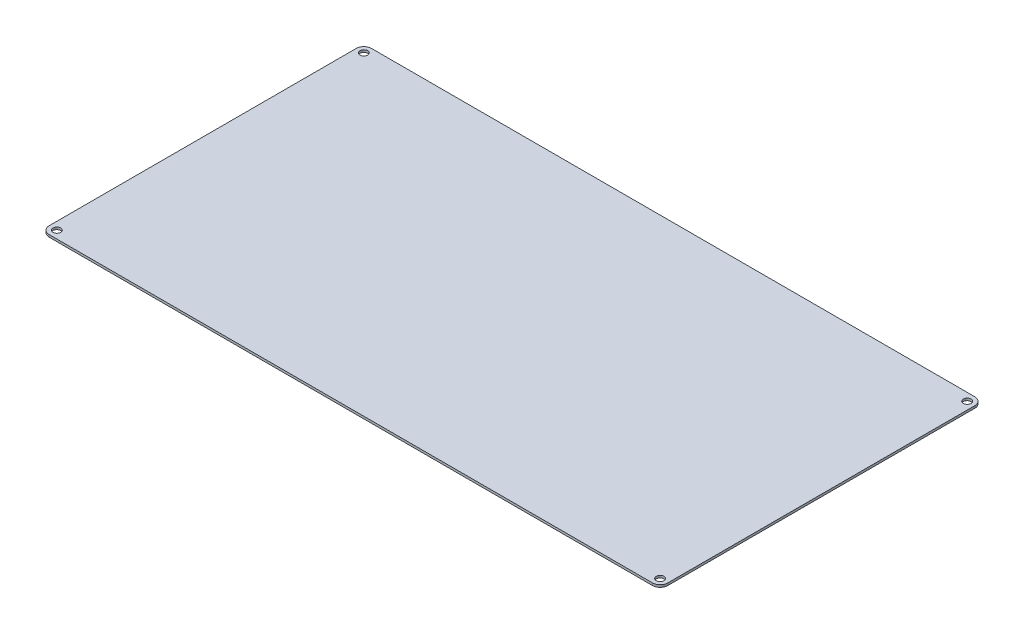
ISO-10303-21;
HEADER;
FILE_DESCRIPTION(('STEP AP214'),'2;1');
FILE_NAME('part.step','',(''),(''),'','','');
FILE_SCHEMA(('AUTOMOTIVE_DESIGN { 1 0 10303 214 1 1 1 1 }'));
ENDSEC;
DATA;
#1=APPLICATION_CONTEXT('core data for automotive mechanical design processes');
#2=APPLICATION_PROTOCOL_DEFINITION('international standard','automotive_design',2000,#1);
#3=PRODUCT_CONTEXT('',#1,'mechanical');
#4=PRODUCT('Part','Part','',(#3));
#5=PRODUCT_RELATED_PRODUCT_CATEGORY('part','',(#4));
#6=PRODUCT_DEFINITION_FORMATION('','',#4);
#7=PRODUCT_DEFINITION_CONTEXT('part definition',#1,'design');
#8=PRODUCT_DEFINITION('design','',#6,#7);
#9=PRODUCT_DEFINITION_SHAPE('','',#8);
#10=(LENGTH_UNIT() NAMED_UNIT(*) SI_UNIT(.MILLI.,.METRE.));
#11=(NAMED_UNIT(*) PLANE_ANGLE_UNIT() SI_UNIT($,.RADIAN.));
#12=(NAMED_UNIT(*) SI_UNIT($,.STERADIAN.) SOLID_ANGLE_UNIT());
#13=UNCERTAINTY_MEASURE_WITH_UNIT(LENGTH_MEASURE(1.E-05),#10,'distance_accuracy_value','');
#14=(GEOMETRIC_REPRESENTATION_CONTEXT(3) GLOBAL_UNCERTAINTY_ASSIGNED_CONTEXT((#13)) GLOBAL_UNIT_ASSIGNED_CONTEXT((#10,
#11,#12)) REPRESENTATION_CONTEXT('',''));
#15=CARTESIAN_POINT('',(0.,0.,0.));
#16=DIRECTION('',(0.,0.,1.));
#17=DIRECTION('',(1.,0.,0.));
#18=AXIS2_PLACEMENT_3D('',#15,#16,#17);
#19=CARTESIAN_POINT('',(398.,-1.5,-5.));
#20=DIRECTION('',(0.,1.,0.));
#21=DIRECTION('',(0.,0.,1.));
#22=AXIS2_PLACEMENT_3D('',#19,#20,#21);
#23=CYLINDRICAL_SURFACE('',#22,5.);
#24=CARTESIAN_POINT('',(398.,0.,-5.));
#25=DIRECTION('',(0.,1.,0.));
#26=DIRECTION('',(0.,0.,-1.));
#27=AXIS2_PLACEMENT_3D('',#24,#25,#26);
#28=CIRCLE('',#27,5.);
#29=CARTESIAN_POINT('',(398.,0.,0.));
#30=VERTEX_POINT('',#29);
#31=CARTESIAN_POINT('',(403.,0.,-5.));
#32=VERTEX_POINT('',#31);
#33=EDGE_CURVE('E135',#30,#32,#28,.T.);
#34=ORIENTED_EDGE('',*,*,#33,.F.);
#35=DIRECTION('',(0.,1.,0.));
#36=VECTOR('',#35,1.);
#37=CARTESIAN_POINT('',(398.,-1.5,0.));
#38=LINE('',#37,#36);
#39=CARTESIAN_POINT('',(398.,-1.5,0.));
#40=VERTEX_POINT('',#39);
#41=EDGE_CURVE('E11',#40,#30,#38,.T.);
#42=ORIENTED_EDGE('',*,*,#41,.F.);
#43=CARTESIAN_POINT('',(398.,-1.5,-5.));
#44=DIRECTION('',(0.,1.,0.));
#45=DIRECTION('',(0.,0.,-1.));
#46=AXIS2_PLACEMENT_3D('',#43,#44,#45);
#47=CIRCLE('',#46,5.);
#48=CARTESIAN_POINT('',(403.,-1.5,-5.));
#49=VERTEX_POINT('',#48);
#50=EDGE_CURVE('E156',#40,#49,#47,.T.);
#51=ORIENTED_EDGE('',*,*,#50,.T.);
#52=DIRECTION('',(0.,1.,0.));
#53=VECTOR('',#52,1.);
#54=CARTESIAN_POINT('',(403.,-1.5,-5.));
#55=LINE('',#54,#53);
#56=EDGE_CURVE('E41',#49,#32,#55,.T.);
#57=ORIENTED_EDGE('',*,*,#56,.T.);
#58=EDGE_LOOP('',(#34,#42,#51,#57));
#59=FACE_BOUND('',#58,.T.);
#60=ADVANCED_FACE('F38',(#59),#23,.T.);
#61=CARTESIAN_POINT('',(5.00000000000004,-1.5,0.));
#62=DIRECTION('',(0.,0.,1.));
#63=DIRECTION('',(1.,0.,0.));
#64=AXIS2_PLACEMENT_3D('',#61,#62,#63);
#65=PLANE('',#64);
#66=DIRECTION('',(1.,0.,0.));
#67=VECTOR('',#66,1.);
#68=CARTESIAN_POINT('',(5.00000000000004,0.,0.));
#69=LINE('',#68,#67);
#70=CARTESIAN_POINT('',(5.00000000000004,0.,0.));
#71=VERTEX_POINT('',#70);
#72=EDGE_CURVE('E154',#71,#30,#69,.T.);
#73=ORIENTED_EDGE('',*,*,#72,.F.);
#74=DIRECTION('',(0.,1.,0.));
#75=VECTOR('',#74,1.);
#76=CARTESIAN_POINT('',(5.00000000000004,-1.5,0.));
#77=LINE('',#76,#75);
#78=CARTESIAN_POINT('',(5.00000000000004,-1.5,0.));
#79=VERTEX_POINT('',#78);
#80=EDGE_CURVE('E47',#79,#71,#77,.T.);
#81=ORIENTED_EDGE('',*,*,#80,.F.);
#82=DIRECTION('',(1.,0.,0.));
#83=VECTOR('',#82,1.);
#84=CARTESIAN_POINT('',(5.00000000000004,-1.5,0.));
#85=LINE('',#84,#83);
#86=EDGE_CURVE('E125',#79,#40,#85,.T.);
#87=ORIENTED_EDGE('',*,*,#86,.T.);
#88=ORIENTED_EDGE('',*,*,#41,.T.);
#89=EDGE_LOOP('',(#73,#81,#87,#88));
#90=FACE_BOUND('',#89,.T.);
#91=ADVANCED_FACE('F168',(#90),#65,.T.);
#92=CARTESIAN_POINT('',(5.,-1.5,-5.));
#93=DIRECTION('',(0.,1.,0.));
#94=DIRECTION('',(0.,0.,1.));
#95=AXIS2_PLACEMENT_3D('',#92,#93,#94);
#96=CYLINDRICAL_SURFACE('',#95,5.);
#97=CARTESIAN_POINT('',(5.,0.,-5.));
#98=DIRECTION('',(0.,1.,0.));
#99=DIRECTION('',(0.,0.,-1.));
#100=AXIS2_PLACEMENT_3D('',#97,#98,#99);
#101=CIRCLE('',#100,5.);
#102=CARTESIAN_POINT('',(0.,0.,-5.00000000000004));
#103=VERTEX_POINT('',#102);
#104=EDGE_CURVE('E112',#103,#71,#101,.T.);
#105=ORIENTED_EDGE('',*,*,#104,.F.);
#106=DIRECTION('',(0.,1.,0.));
#107=VECTOR('',#106,1.);
#108=CARTESIAN_POINT('',(0.,-1.5,-5.00000000000004));
#109=LINE('',#108,#107);
#110=CARTESIAN_POINT('',(0.,-1.5,-5.00000000000004));
#111=VERTEX_POINT('',#110);
#112=EDGE_CURVE('E107',#111,#103,#109,.T.);
#113=ORIENTED_EDGE('',*,*,#112,.F.);
#114=CARTESIAN_POINT('',(5.,-1.5,-5.));
#115=DIRECTION('',(0.,1.,0.));
#116=DIRECTION('',(0.,0.,-1.));
#117=AXIS2_PLACEMENT_3D('',#114,#115,#116);
#118=CIRCLE('',#117,5.);
#119=EDGE_CURVE('E110',#111,#79,#118,.T.);
#120=ORIENTED_EDGE('',*,*,#119,.T.);
#121=ORIENTED_EDGE('',*,*,#80,.T.);
#122=EDGE_LOOP('',(#105,#113,#120,#121));
#123=FACE_BOUND('',#122,.T.);
#124=ADVANCED_FACE('F109',(#123),#96,.T.);
#125=CARTESIAN_POINT('',(0.,-1.5,-5.00000000000004));
#126=DIRECTION('',(-1.,0.,0.));
#127=DIRECTION('',(0.,0.,1.));
#128=AXIS2_PLACEMENT_3D('',#125,#126,#127);
#129=PLANE('',#128);
#130=DIRECTION('',(0.,0.,1.));
#131=VECTOR('',#130,1.);
#132=CARTESIAN_POINT('',(0.,0.,-5.00000000000004));
#133=LINE('',#132,#131);
#134=CARTESIAN_POINT('',(0.,0.,-205.));
#135=VERTEX_POINT('',#134);
#136=EDGE_CURVE('E151',#135,#103,#133,.T.);
#137=ORIENTED_EDGE('',*,*,#136,.F.);
#138=DIRECTION('',(0.,1.,0.));
#139=VECTOR('',#138,1.);
#140=CARTESIAN_POINT('',(0.,-1.5,-205.));
#141=LINE('',#140,#139);
#142=CARTESIAN_POINT('',(0.,-1.5,-205.));
#143=VERTEX_POINT('',#142);
#144=EDGE_CURVE('E117',#143,#135,#141,.T.);
#145=ORIENTED_EDGE('',*,*,#144,.F.);
#146=DIRECTION('',(0.,0.,1.));
#147=VECTOR('',#146,1.);
#148=CARTESIAN_POINT('',(0.,-1.5,-5.00000000000004));
#149=LINE('',#148,#147);
#150=EDGE_CURVE('E123',#143,#111,#149,.T.);
#151=ORIENTED_EDGE('',*,*,#150,.T.);
#152=ORIENTED_EDGE('',*,*,#112,.T.);
#153=EDGE_LOOP('',(#137,#145,#151,#152));
#154=FACE_BOUND('',#153,.T.);
#155=ADVANCED_FACE('F127',(#154),#129,.T.);
#156=CARTESIAN_POINT('',(5.,-1.5,-205.));
#157=DIRECTION('',(0.,1.,0.));
#158=DIRECTION('',(0.,0.,1.));
#159=AXIS2_PLACEMENT_3D('',#156,#157,#158);
#160=CYLINDRICAL_SURFACE('',#159,5.00000000000002);
#161=CARTESIAN_POINT('',(5.,0.,-205.));
#162=DIRECTION('',(0.,1.,0.));
#163=DIRECTION('',(0.,0.,1.));
#164=AXIS2_PLACEMENT_3D('',#161,#162,#163);
#165=CIRCLE('',#164,5.00000000000002);
#166=CARTESIAN_POINT('',(5.,0.,-210.));
#167=VERTEX_POINT('',#166);
#168=EDGE_CURVE('E148',#167,#135,#165,.T.);
#169=ORIENTED_EDGE('',*,*,#168,.F.);
#170=DIRECTION('',(0.,1.,0.));
#171=VECTOR('',#170,1.);
#172=CARTESIAN_POINT('',(5.,-1.5,-210.));
#173=LINE('',#172,#171);
#174=CARTESIAN_POINT('',(5.,-1.5,-210.));
#175=VERTEX_POINT('',#174);
#176=EDGE_CURVE('E160',#175,#167,#173,.T.);
#177=ORIENTED_EDGE('',*,*,#176,.F.);
#178=CARTESIAN_POINT('',(5.,-1.5,-205.));
#179=DIRECTION('',(0.,1.,0.));
#180=DIRECTION('',(0.,0.,1.));
#181=AXIS2_PLACEMENT_3D('',#178,#179,#180);
#182=CIRCLE('',#181,5.00000000000002);
#183=EDGE_CURVE('E128',#175,#143,#182,.T.);
#184=ORIENTED_EDGE('',*,*,#183,.T.);
#185=ORIENTED_EDGE('',*,*,#144,.T.);
#186=EDGE_LOOP('',(#169,#177,#184,#185));
#187=FACE_BOUND('',#186,.T.);
#188=ADVANCED_FACE('F181',(#187),#160,.T.);
#189=CARTESIAN_POINT('',(5.,-1.5,-210.));
#190=DIRECTION('',(0.,0.,-1.));
#191=DIRECTION('',(-1.,0.,0.));
#192=AXIS2_PLACEMENT_3D('',#189,#190,#191);
#193=PLANE('',#192);
#194=DIRECTION('',(-1.,0.,0.));
#195=VECTOR('',#194,1.);
#196=CARTESIAN_POINT('',(5.,0.,-210.));
#197=LINE('',#196,#195);
#198=CARTESIAN_POINT('',(398.,0.,-210.));
#199=VERTEX_POINT('',#198);
#200=EDGE_CURVE('E145',#199,#167,#197,.T.);
#201=ORIENTED_EDGE('',*,*,#200,.F.);
#202=DIRECTION('',(0.,1.,0.));
#203=VECTOR('',#202,1.);
#204=CARTESIAN_POINT('',(398.,-1.5,-210.));
#205=LINE('',#204,#203);
#206=CARTESIAN_POINT('',(398.,-1.5,-210.));
#207=VERTEX_POINT('',#206);
#208=EDGE_CURVE('E162',#207,#199,#205,.T.);
#209=ORIENTED_EDGE('',*,*,#208,.F.);
#210=DIRECTION('',(-1.,0.,0.));
#211=VECTOR('',#210,1.);
#212=CARTESIAN_POINT('',(5.,-1.5,-210.));
#213=LINE('',#212,#211);
#214=EDGE_CURVE('E130',#207,#175,#213,.T.);
#215=ORIENTED_EDGE('',*,*,#214,.T.);
#216=ORIENTED_EDGE('',*,*,#176,.T.);
#217=EDGE_LOOP('',(#201,#209,#215,#216));
#218=FACE_BOUND('',#217,.T.);
#219=ADVANCED_FACE('F184',(#218),#193,.T.);
#220=CARTESIAN_POINT('',(398.,-1.5,-205.));
#221=DIRECTION('',(0.,1.,0.));
#222=DIRECTION('',(0.,0.,1.));
#223=AXIS2_PLACEMENT_3D('',#220,#221,#222);
#224=CYLINDRICAL_SURFACE('',#223,5.00000000000002);
#225=CARTESIAN_POINT('',(398.,0.,-205.));
#226=DIRECTION('',(0.,1.,0.));
#227=DIRECTION('',(0.,0.,1.));
#228=AXIS2_PLACEMENT_3D('',#225,#226,#227);
#229=CIRCLE('',#228,5.00000000000002);
#230=CARTESIAN_POINT('',(403.,0.,-205.));
#231=VERTEX_POINT('',#230);
#232=EDGE_CURVE('E142',#231,#199,#229,.T.);
#233=ORIENTED_EDGE('',*,*,#232,.F.);
#234=DIRECTION('',(0.,1.,0.));
#235=VECTOR('',#234,1.);
#236=CARTESIAN_POINT('',(403.,-1.5,-205.));
#237=LINE('',#236,#235);
#238=CARTESIAN_POINT('',(403.,-1.5,-205.));
#239=VERTEX_POINT('',#238);
#240=EDGE_CURVE('E163',#239,#231,#237,.T.);
#241=ORIENTED_EDGE('',*,*,#240,.F.);
#242=CARTESIAN_POINT('',(398.,-1.5,-205.));
#243=DIRECTION('',(0.,1.,0.));
#244=DIRECTION('',(0.,0.,1.));
#245=AXIS2_PLACEMENT_3D('',#242,#243,#244);
#246=CIRCLE('',#245,5.00000000000002);
#247=EDGE_CURVE('E250',#239,#207,#246,.T.);
#248=ORIENTED_EDGE('',*,*,#247,.T.);
#249=ORIENTED_EDGE('',*,*,#208,.T.);
#250=EDGE_LOOP('',(#233,#241,#248,#249));
#251=FACE_BOUND('',#250,.T.);
#252=ADVANCED_FACE('F188',(#251),#224,.T.);
#253=CARTESIAN_POINT('',(403.,-1.5,-5.));
#254=DIRECTION('',(1.,0.,0.));
#255=DIRECTION('',(0.,0.,-1.));
#256=AXIS2_PLACEMENT_3D('',#253,#254,#255);
#257=PLANE('',#256);
#258=DIRECTION('',(0.,0.,-1.));
#259=VECTOR('',#258,1.);
#260=CARTESIAN_POINT('',(403.,0.,-5.));
#261=LINE('',#260,#259);
#262=EDGE_CURVE('E138',#32,#231,#261,.T.);
#263=ORIENTED_EDGE('',*,*,#262,.F.);
#264=ORIENTED_EDGE('',*,*,#56,.F.);
#265=DIRECTION('',(0.,0.,-1.));
#266=VECTOR('',#265,1.);
#267=CARTESIAN_POINT('',(403.,-1.5,-5.));
#268=LINE('',#267,#266);
#269=EDGE_CURVE('E248',#49,#239,#268,.T.);
#270=ORIENTED_EDGE('',*,*,#269,.T.);
#271=ORIENTED_EDGE('',*,*,#240,.T.);
#272=EDGE_LOOP('',(#263,#264,#270,#271));
#273=FACE_BOUND('',#272,.T.);
#274=ADVANCED_FACE('F165',(#273),#257,.T.);
#275=CARTESIAN_POINT('',(398.,-1.5,-5.));
#276=DIRECTION('',(0.,-1.,0.));
#277=DIRECTION('',(0.,0.,-1.));
#278=AXIS2_PLACEMENT_3D('',#275,#276,#277);
#279=PLANE('',#278);
#280=CARTESIAN_POINT('',(398.,-1.5,-205.));
#281=DIRECTION('',(0.,1.,0.));
#282=DIRECTION('',(0.,0.,1.));
#283=AXIS2_PLACEMENT_3D('',#280,#281,#282);
#284=CIRCLE('',#283,2.50000000000002);
#285=CARTESIAN_POINT('',(398.,-1.5,-202.5));
#286=VERTEX_POINT('',#285);
#287=EDGE_CURVE('E223',#286,#286,#284,.T.);
#288=ORIENTED_EDGE('',*,*,#287,.T.);
#289=EDGE_LOOP('',(#288));
#290=FACE_BOUND('',#289,.T.);
#291=CARTESIAN_POINT('',(398.,-1.5,-5.));
#292=DIRECTION('',(0.,1.,0.));
#293=DIRECTION('',(0.,0.,1.));
#294=AXIS2_PLACEMENT_3D('',#291,#292,#293);
#295=CIRCLE('',#294,2.50000000000002);
#296=CARTESIAN_POINT('',(398.,-1.5,-2.49999999999998));
#297=VERTEX_POINT('',#296);
#298=EDGE_CURVE('E231',#297,#297,#295,.T.);
#299=ORIENTED_EDGE('',*,*,#298,.T.);
#300=EDGE_LOOP('',(#299));
#301=FACE_BOUND('',#300,.T.);
#302=CARTESIAN_POINT('',(5.,-1.5,-5.));
#303=DIRECTION('',(0.,1.,0.));
#304=DIRECTION('',(0.,0.,1.));
#305=AXIS2_PLACEMENT_3D('',#302,#303,#304);
#306=CIRCLE('',#305,2.5);
#307=CARTESIAN_POINT('',(5.,-1.5,-2.5));
#308=VERTEX_POINT('',#307);
#309=EDGE_CURVE('E237',#308,#308,#306,.T.);
#310=ORIENTED_EDGE('',*,*,#309,.T.);
#311=EDGE_LOOP('',(#310));
#312=FACE_BOUND('',#311,.T.);
#313=CARTESIAN_POINT('',(5.,-1.5,-205.));
#314=DIRECTION('',(0.,1.,0.));
#315=DIRECTION('',(0.,0.,1.));
#316=AXIS2_PLACEMENT_3D('',#313,#314,#315);
#317=CIRCLE('',#316,2.5);
#318=CARTESIAN_POINT('',(5.,-1.5,-202.5));
#319=VERTEX_POINT('',#318);
#320=EDGE_CURVE('E139',#319,#319,#317,.T.);
#321=ORIENTED_EDGE('',*,*,#320,.T.);
#322=EDGE_LOOP('',(#321));
#323=FACE_BOUND('',#322,.T.);
#324=ORIENTED_EDGE('',*,*,#50,.F.);
#325=ORIENTED_EDGE('',*,*,#86,.F.);
#326=ORIENTED_EDGE('',*,*,#119,.F.);
#327=ORIENTED_EDGE('',*,*,#150,.F.);
#328=ORIENTED_EDGE('',*,*,#183,.F.);
#329=ORIENTED_EDGE('',*,*,#214,.F.);
#330=ORIENTED_EDGE('',*,*,#247,.F.);
#331=ORIENTED_EDGE('',*,*,#269,.F.);
#332=EDGE_LOOP('',(#324,#325,#326,#327,#328,#329,#330,#331));
#333=FACE_BOUND('',#332,.T.);
#334=ADVANCED_FACE('F121',(#290,#301,#312,#323,#333),#279,.T.);
#335=CARTESIAN_POINT('',(398.,0.,-5.));
#336=DIRECTION('',(0.,-1.,0.));
#337=DIRECTION('',(0.,0.,-1.));
#338=AXIS2_PLACEMENT_3D('',#335,#336,#337);
#339=PLANE('',#338);
#340=CARTESIAN_POINT('',(398.,0.,-205.));
#341=DIRECTION('',(0.,1.,0.));
#342=DIRECTION('',(0.,0.,1.));
#343=AXIS2_PLACEMENT_3D('',#340,#341,#342);
#344=CIRCLE('',#343,2.50000000000002);
#345=CARTESIAN_POINT('',(398.,0.,-202.5));
#346=VERTEX_POINT('',#345);
#347=EDGE_CURVE('E226',#346,#346,#344,.T.);
#348=ORIENTED_EDGE('',*,*,#347,.F.);
#349=EDGE_LOOP('',(#348));
#350=FACE_BOUND('',#349,.T.);
#351=CARTESIAN_POINT('',(398.,0.,-5.));
#352=DIRECTION('',(0.,1.,0.));
#353=DIRECTION('',(0.,0.,1.));
#354=AXIS2_PLACEMENT_3D('',#351,#352,#353);
#355=CIRCLE('',#354,2.50000000000002);
#356=CARTESIAN_POINT('',(398.,0.,-2.49999999999998));
#357=VERTEX_POINT('',#356);
#358=EDGE_CURVE('E228',#357,#357,#355,.T.);
#359=ORIENTED_EDGE('',*,*,#358,.F.);
#360=EDGE_LOOP('',(#359));
#361=FACE_BOUND('',#360,.T.);
#362=CARTESIAN_POINT('',(5.,0.,-5.));
#363=DIRECTION('',(0.,1.,0.));
#364=DIRECTION('',(0.,0.,1.));
#365=AXIS2_PLACEMENT_3D('',#362,#363,#364);
#366=CIRCLE('',#365,2.5);
#367=CARTESIAN_POINT('',(5.,0.,-2.5));
#368=VERTEX_POINT('',#367);
#369=EDGE_CURVE('E234',#368,#368,#366,.T.);
#370=ORIENTED_EDGE('',*,*,#369,.F.);
#371=EDGE_LOOP('',(#370));
#372=FACE_BOUND('',#371,.T.);
#373=CARTESIAN_POINT('',(5.,0.,-205.));
#374=DIRECTION('',(0.,1.,0.));
#375=DIRECTION('',(0.,0.,1.));
#376=AXIS2_PLACEMENT_3D('',#373,#374,#375);
#377=CIRCLE('',#376,2.5);
#378=CARTESIAN_POINT('',(5.,0.,-202.5));
#379=VERTEX_POINT('',#378);
#380=EDGE_CURVE('E240',#379,#379,#377,.T.);
#381=ORIENTED_EDGE('',*,*,#380,.F.);
#382=EDGE_LOOP('',(#381));
#383=FACE_BOUND('',#382,.T.);
#384=ORIENTED_EDGE('',*,*,#33,.T.);
#385=ORIENTED_EDGE('',*,*,#262,.T.);
#386=ORIENTED_EDGE('',*,*,#232,.T.);
#387=ORIENTED_EDGE('',*,*,#200,.T.);
#388=ORIENTED_EDGE('',*,*,#168,.T.);
#389=ORIENTED_EDGE('',*,*,#136,.T.);
#390=ORIENTED_EDGE('',*,*,#104,.T.);
#391=ORIENTED_EDGE('',*,*,#72,.T.);
#392=EDGE_LOOP('',(#384,#385,#386,#387,#388,#389,#390,#391));
#393=FACE_BOUND('',#392,.T.);
#394=ADVANCED_FACE('F167',(#350,#361,#372,#383,#393),#339,.F.);
#395=CARTESIAN_POINT('',(5.,-1.5,-205.));
#396=DIRECTION('',(0.,1.,0.));
#397=DIRECTION('',(0.,0.,1.));
#398=AXIS2_PLACEMENT_3D('',#395,#396,#397);
#399=CYLINDRICAL_SURFACE('',#398,2.5);
#400=ORIENTED_EDGE('',*,*,#320,.F.);
#401=EDGE_LOOP('',(#400));
#402=FACE_BOUND('',#401,.T.);
#403=ORIENTED_EDGE('',*,*,#380,.T.);
#404=EDGE_LOOP('',(#403));
#405=FACE_BOUND('',#404,.T.);
#406=ADVANCED_FACE('F200',(#402,#405),#399,.F.);
#407=CARTESIAN_POINT('',(5.,-1.5,-5.));
#408=DIRECTION('',(0.,1.,0.));
#409=DIRECTION('',(0.,0.,1.));
#410=AXIS2_PLACEMENT_3D('',#407,#408,#409);
#411=CYLINDRICAL_SURFACE('',#410,2.5);
#412=ORIENTED_EDGE('',*,*,#309,.F.);
#413=EDGE_LOOP('',(#412));
#414=FACE_BOUND('',#413,.T.);
#415=ORIENTED_EDGE('',*,*,#369,.T.);
#416=EDGE_LOOP('',(#415));
#417=FACE_BOUND('',#416,.T.);
#418=ADVANCED_FACE('F207',(#414,#417),#411,.F.);
#419=CARTESIAN_POINT('',(398.,-1.5,-5.));
#420=DIRECTION('',(0.,1.,0.));
#421=DIRECTION('',(0.,0.,1.));
#422=AXIS2_PLACEMENT_3D('',#419,#420,#421);
#423=CYLINDRICAL_SURFACE('',#422,2.50000000000002);
#424=ORIENTED_EDGE('',*,*,#298,.F.);
#425=EDGE_LOOP('',(#424));
#426=FACE_BOUND('',#425,.T.);
#427=ORIENTED_EDGE('',*,*,#358,.T.);
#428=EDGE_LOOP('',(#427));
#429=FACE_BOUND('',#428,.T.);
#430=ADVANCED_FACE('F211',(#426,#429),#423,.F.);
#431=CARTESIAN_POINT('',(398.,-1.5,-205.));
#432=DIRECTION('',(0.,1.,0.));
#433=DIRECTION('',(0.,0.,1.));
#434=AXIS2_PLACEMENT_3D('',#431,#432,#433);
#435=CYLINDRICAL_SURFACE('',#434,2.50000000000002);
#436=ORIENTED_EDGE('',*,*,#287,.F.);
#437=EDGE_LOOP('',(#436));
#438=FACE_BOUND('',#437,.T.);
#439=ORIENTED_EDGE('',*,*,#347,.T.);
#440=EDGE_LOOP('',(#439));
#441=FACE_BOUND('',#440,.T.);
#442=ADVANCED_FACE('F215',(#438,#441),#435,.F.);
#443=CLOSED_SHELL('',(#60,#91,#124,#155,#188,#219,#252,#274,#334,#394,#406,#418,#430,#442));
#444=MANIFOLD_SOLID_BREP('B2',#443);
#445=ADVANCED_BREP_SHAPE_REPRESENTATION('',(#18,#444),#14);
#446=SHAPE_DEFINITION_REPRESENTATION(#9,#445);
ENDSEC;
END-ISO-10303-21;
